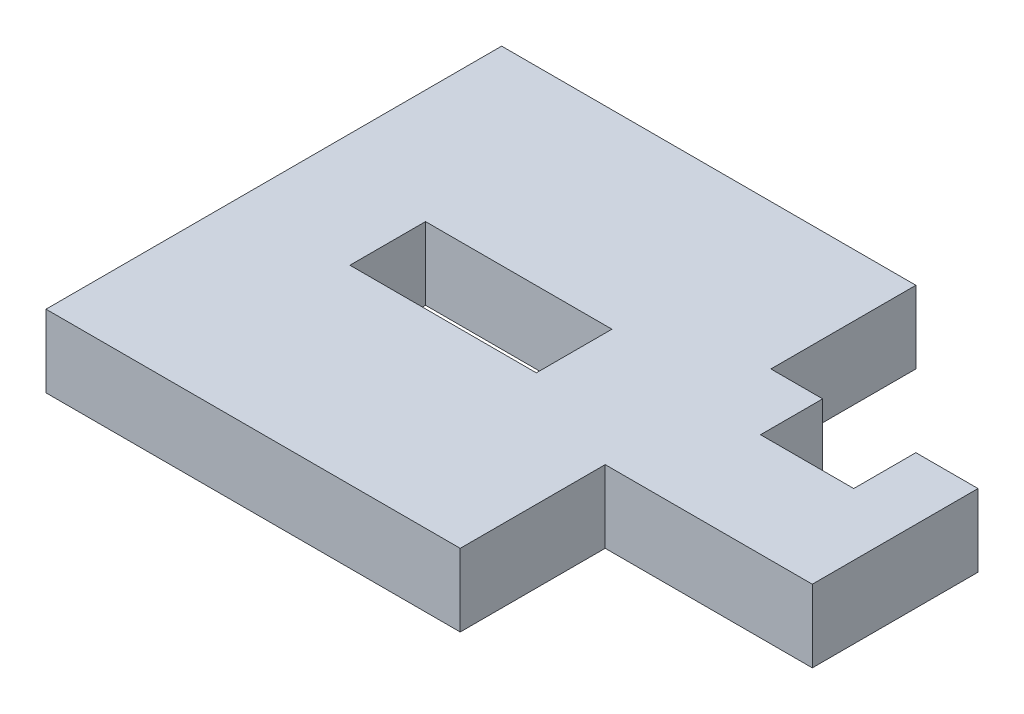
ISO-10303-21;
HEADER;
FILE_DESCRIPTION(('STEP AP214'),'2;1');
FILE_NAME('part.step','',(''),(''),'','','');
FILE_SCHEMA(('AUTOMOTIVE_DESIGN { 1 0 10303 214 1 1 1 1 }'));
ENDSEC;
DATA;
#1=APPLICATION_CONTEXT('core data for automotive mechanical design processes');
#2=APPLICATION_PROTOCOL_DEFINITION('international standard','automotive_design',2000,#1);
#3=PRODUCT_CONTEXT('',#1,'mechanical');
#4=PRODUCT('Part','Part','',(#3));
#5=PRODUCT_RELATED_PRODUCT_CATEGORY('part','',(#4));
#6=PRODUCT_DEFINITION_FORMATION('','',#4);
#7=PRODUCT_DEFINITION_CONTEXT('part definition',#1,'design');
#8=PRODUCT_DEFINITION('design','',#6,#7);
#9=PRODUCT_DEFINITION_SHAPE('','',#8);
#10=(LENGTH_UNIT() NAMED_UNIT(*) SI_UNIT(.MILLI.,.METRE.));
#11=(NAMED_UNIT(*) PLANE_ANGLE_UNIT() SI_UNIT($,.RADIAN.));
#12=(NAMED_UNIT(*) SI_UNIT($,.STERADIAN.) SOLID_ANGLE_UNIT());
#13=UNCERTAINTY_MEASURE_WITH_UNIT(LENGTH_MEASURE(1.E-05),#10,'distance_accuracy_value','');
#14=(GEOMETRIC_REPRESENTATION_CONTEXT(3) GLOBAL_UNCERTAINTY_ASSIGNED_CONTEXT((#13)) GLOBAL_UNIT_ASSIGNED_CONTEXT((#10,
#11,#12)) REPRESENTATION_CONTEXT('',''));
#15=CARTESIAN_POINT('',(0.,0.,0.));
#16=DIRECTION('',(0.,0.,1.));
#17=DIRECTION('',(1.,0.,0.));
#18=AXIS2_PLACEMENT_3D('',#15,#16,#17);
#19=CARTESIAN_POINT('',(0.,4.,0.));
#20=DIRECTION('',(0.,1.,0.));
#21=DIRECTION('',(0.,0.,1.));
#22=AXIS2_PLACEMENT_3D('',#19,#20,#21);
#23=PLANE('',#22);
#24=DIRECTION('',(-1.,0.,0.));
#25=VECTOR('',#24,1.);
#26=CARTESIAN_POINT('',(4.5,4.,-1.825));
#27=LINE('',#26,#25);
#28=CARTESIAN_POINT('',(4.5,4.,-1.825));
#29=VERTEX_POINT('',#28);
#30=CARTESIAN_POINT('',(-4.5,4.,-1.825));
#31=VERTEX_POINT('',#30);
#32=EDGE_CURVE('E253',#29,#31,#27,.T.);
#33=ORIENTED_EDGE('',*,*,#32,.F.);
#34=DIRECTION('',(0.,0.,-1.));
#35=VECTOR('',#34,1.);
#36=CARTESIAN_POINT('',(4.5,4.,1.825));
#37=LINE('',#36,#35);
#38=CARTESIAN_POINT('',(4.5,4.,1.825));
#39=VERTEX_POINT('',#38);
#40=EDGE_CURVE('E251',#39,#29,#37,.T.);
#41=ORIENTED_EDGE('',*,*,#40,.F.);
#42=DIRECTION('',(1.,0.,0.));
#43=VECTOR('',#42,1.);
#44=CARTESIAN_POINT('',(4.5,4.,1.825));
#45=LINE('',#44,#43);
#46=CARTESIAN_POINT('',(-4.5,4.,1.825));
#47=VERTEX_POINT('',#46);
#48=EDGE_CURVE('E258',#47,#39,#45,.T.);
#49=ORIENTED_EDGE('',*,*,#48,.F.);
#50=DIRECTION('',(0.,0.,1.));
#51=VECTOR('',#50,1.);
#52=CARTESIAN_POINT('',(-4.5,4.,1.825));
#53=LINE('',#52,#51);
#54=EDGE_CURVE('E255',#31,#47,#53,.T.);
#55=ORIENTED_EDGE('',*,*,#54,.F.);
#56=EDGE_LOOP('',(#33,#41,#49,#55));
#57=FACE_BOUND('',#56,.T.);
#58=DIRECTION('',(1.,0.,0.));
#59=VECTOR('',#58,1.);
#60=CARTESIAN_POINT('',(12.5,4.,-1.));
#61=LINE('',#60,#59);
#62=CARTESIAN_POINT('',(12.5,4.,-1.));
#63=VERTEX_POINT('',#62);
#64=CARTESIAN_POINT('',(17.,4.,-1.));
#65=VERTEX_POINT('',#64);
#66=EDGE_CURVE('E210',#63,#65,#61,.T.);
#67=ORIENTED_EDGE('',*,*,#66,.F.);
#68=DIRECTION('',(0.,0.,1.));
#69=VECTOR('',#68,1.);
#70=CARTESIAN_POINT('',(12.5,4.,-4.));
#71=LINE('',#70,#69);
#72=CARTESIAN_POINT('',(12.5,4.,-4.));
#73=VERTEX_POINT('',#72);
#74=EDGE_CURVE('E200',#73,#63,#71,.T.);
#75=ORIENTED_EDGE('',*,*,#74,.F.);
#76=DIRECTION('',(-1.,0.,0.));
#77=VECTOR('',#76,1.);
#78=CARTESIAN_POINT('',(10.,4.,-4.));
#79=LINE('',#78,#77);
#80=CARTESIAN_POINT('',(10.,4.,-4.));
#81=VERTEX_POINT('',#80);
#82=EDGE_CURVE('E236',#73,#81,#79,.T.);
#83=ORIENTED_EDGE('',*,*,#82,.T.);
#84=DIRECTION('',(0.,0.,-1.));
#85=VECTOR('',#84,1.);
#86=CARTESIAN_POINT('',(10.,4.,-11.));
#87=LINE('',#86,#85);
#88=CARTESIAN_POINT('',(10.,4.,-11.));
#89=VERTEX_POINT('',#88);
#90=EDGE_CURVE('E274',#81,#89,#87,.T.);
#91=ORIENTED_EDGE('',*,*,#90,.T.);
#92=DIRECTION('',(-1.,0.,0.));
#93=VECTOR('',#92,1.);
#94=CARTESIAN_POINT('',(-10.,4.,-11.));
#95=LINE('',#94,#93);
#96=CARTESIAN_POINT('',(-10.,4.,-11.));
#97=VERTEX_POINT('',#96);
#98=EDGE_CURVE('E278',#89,#97,#95,.T.);
#99=ORIENTED_EDGE('',*,*,#98,.T.);
#100=DIRECTION('',(0.,0.,1.));
#101=VECTOR('',#100,1.);
#102=CARTESIAN_POINT('',(-10.,4.,-11.));
#103=LINE('',#102,#101);
#104=CARTESIAN_POINT('',(-10.,4.,11.));
#105=VERTEX_POINT('',#104);
#106=EDGE_CURVE('E269',#97,#105,#103,.T.);
#107=ORIENTED_EDGE('',*,*,#106,.T.);
#108=DIRECTION('',(1.,0.,0.));
#109=VECTOR('',#108,1.);
#110=CARTESIAN_POINT('',(-10.,4.,11.));
#111=LINE('',#110,#109);
#112=CARTESIAN_POINT('',(10.,4.,11.));
#113=VERTEX_POINT('',#112);
#114=EDGE_CURVE('E272',#105,#113,#111,.T.);
#115=ORIENTED_EDGE('',*,*,#114,.T.);
#116=CARTESIAN_POINT('',(10.,4.,4.));
#117=VERTEX_POINT('',#116);
#118=EDGE_CURVE('E275',#113,#117,#87,.T.);
#119=ORIENTED_EDGE('',*,*,#118,.T.);
#120=DIRECTION('',(1.,0.,0.));
#121=VECTOR('',#120,1.);
#122=CARTESIAN_POINT('',(20.,4.,4.));
#123=LINE('',#122,#121);
#124=CARTESIAN_POINT('',(20.,4.,4.));
#125=VERTEX_POINT('',#124);
#126=EDGE_CURVE('E219',#117,#125,#123,.T.);
#127=ORIENTED_EDGE('',*,*,#126,.T.);
#128=DIRECTION('',(0.,0.,-1.));
#129=VECTOR('',#128,1.);
#130=CARTESIAN_POINT('',(20.,4.,-4.));
#131=LINE('',#130,#129);
#132=CARTESIAN_POINT('',(20.,4.,-4.));
#133=VERTEX_POINT('',#132);
#134=EDGE_CURVE('E234',#125,#133,#131,.T.);
#135=ORIENTED_EDGE('',*,*,#134,.T.);
#136=CARTESIAN_POINT('',(17.,4.,-4.));
#137=VERTEX_POINT('',#136);
#138=EDGE_CURVE('E237',#133,#137,#79,.T.);
#139=ORIENTED_EDGE('',*,*,#138,.T.);
#140=DIRECTION('',(0.,0.,-1.));
#141=VECTOR('',#140,1.);
#142=CARTESIAN_POINT('',(17.,4.,-4.));
#143=LINE('',#142,#141);
#144=EDGE_CURVE('E224',#65,#137,#143,.T.);
#145=ORIENTED_EDGE('',*,*,#144,.F.);
#146=EDGE_LOOP('',(#67,#75,#83,#91,#99,#107,#115,#119,#127,#135,#139,#145));
#147=FACE_BOUND('',#146,.T.);
#148=ADVANCED_FACE('F35',(#57,#147),#23,.T.);
#149=CARTESIAN_POINT('',(0.,0.,0.));
#150=DIRECTION('',(0.,1.,0.));
#151=DIRECTION('',(0.,0.,1.));
#152=AXIS2_PLACEMENT_3D('',#149,#150,#151);
#153=PLANE('',#152);
#154=DIRECTION('',(0.,0.,1.));
#155=VECTOR('',#154,1.);
#156=CARTESIAN_POINT('',(9.5,0.,0.));
#157=LINE('',#156,#155);
#158=CARTESIAN_POINT('',(9.5,0.,-10.5));
#159=VERTEX_POINT('',#158);
#160=CARTESIAN_POINT('',(9.5,0.,-3.5));
#161=VERTEX_POINT('',#160);
#162=EDGE_CURVE('E324',#159,#161,#157,.T.);
#163=ORIENTED_EDGE('',*,*,#162,.T.);
#164=DIRECTION('',(1.,0.,0.));
#165=VECTOR('',#164,1.);
#166=CARTESIAN_POINT('',(0.,0.,-3.5));
#167=LINE('',#166,#165);
#168=CARTESIAN_POINT('',(12.,0.,-3.5));
#169=VERTEX_POINT('',#168);
#170=EDGE_CURVE('E326',#161,#169,#167,.T.);
#171=ORIENTED_EDGE('',*,*,#170,.T.);
#172=DIRECTION('',(0.,0.,1.));
#173=VECTOR('',#172,1.);
#174=CARTESIAN_POINT('',(12.,0.,-1.));
#175=LINE('',#174,#173);
#176=CARTESIAN_POINT('',(12.,0.,-0.500000000000003));
#177=VERTEX_POINT('',#176);
#178=EDGE_CURVE('E304',#169,#177,#175,.T.);
#179=ORIENTED_EDGE('',*,*,#178,.T.);
#180=DIRECTION('',(1.,0.,0.));
#181=VECTOR('',#180,1.);
#182=CARTESIAN_POINT('',(17.,0.,-0.500000000000003));
#183=LINE('',#182,#181);
#184=CARTESIAN_POINT('',(17.5,0.,-0.500000000000003));
#185=VERTEX_POINT('',#184);
#186=EDGE_CURVE('E306',#177,#185,#183,.T.);
#187=ORIENTED_EDGE('',*,*,#186,.T.);
#188=DIRECTION('',(0.,0.,-1.));
#189=VECTOR('',#188,1.);
#190=CARTESIAN_POINT('',(17.5,0.,-4.));
#191=LINE('',#190,#189);
#192=CARTESIAN_POINT('',(17.5,0.,-3.5));
#193=VERTEX_POINT('',#192);
#194=EDGE_CURVE('E308',#185,#193,#191,.T.);
#195=ORIENTED_EDGE('',*,*,#194,.T.);
#196=DIRECTION('',(1.,0.,0.));
#197=VECTOR('',#196,1.);
#198=CARTESIAN_POINT('',(0.,0.,-3.5));
#199=LINE('',#198,#197);
#200=CARTESIAN_POINT('',(19.5,0.,-3.5));
#201=VERTEX_POINT('',#200);
#202=EDGE_CURVE('E310',#193,#201,#199,.T.);
#203=ORIENTED_EDGE('',*,*,#202,.T.);
#204=DIRECTION('',(0.,0.,1.));
#205=VECTOR('',#204,1.);
#206=CARTESIAN_POINT('',(19.5,0.,0.));
#207=LINE('',#206,#205);
#208=CARTESIAN_POINT('',(19.5,0.,3.5));
#209=VERTEX_POINT('',#208);
#210=EDGE_CURVE('E312',#201,#209,#207,.T.);
#211=ORIENTED_EDGE('',*,*,#210,.T.);
#212=DIRECTION('',(-1.,0.,0.));
#213=VECTOR('',#212,1.);
#214=CARTESIAN_POINT('',(0.,0.,3.5));
#215=LINE('',#214,#213);
#216=CARTESIAN_POINT('',(9.5,0.,3.5));
#217=VERTEX_POINT('',#216);
#218=EDGE_CURVE('E314',#209,#217,#215,.T.);
#219=ORIENTED_EDGE('',*,*,#218,.T.);
#220=DIRECTION('',(0.,0.,1.));
#221=VECTOR('',#220,1.);
#222=CARTESIAN_POINT('',(9.5,0.,0.));
#223=LINE('',#222,#221);
#224=CARTESIAN_POINT('',(9.5,0.,10.5));
#225=VERTEX_POINT('',#224);
#226=EDGE_CURVE('E316',#217,#225,#223,.T.);
#227=ORIENTED_EDGE('',*,*,#226,.T.);
#228=DIRECTION('',(-1.,0.,0.));
#229=VECTOR('',#228,1.);
#230=CARTESIAN_POINT('',(0.,0.,10.5));
#231=LINE('',#230,#229);
#232=CARTESIAN_POINT('',(-9.5,0.,10.5));
#233=VERTEX_POINT('',#232);
#234=EDGE_CURVE('E318',#225,#233,#231,.T.);
#235=ORIENTED_EDGE('',*,*,#234,.T.);
#236=DIRECTION('',(0.,0.,-1.));
#237=VECTOR('',#236,1.);
#238=CARTESIAN_POINT('',(-9.5,0.,0.));
#239=LINE('',#238,#237);
#240=CARTESIAN_POINT('',(-9.5,0.,-10.5));
#241=VERTEX_POINT('',#240);
#242=EDGE_CURVE('E320',#233,#241,#239,.T.);
#243=ORIENTED_EDGE('',*,*,#242,.T.);
#244=DIRECTION('',(1.,0.,0.));
#245=VECTOR('',#244,1.);
#246=CARTESIAN_POINT('',(0.,0.,-10.5));
#247=LINE('',#246,#245);
#248=EDGE_CURVE('E322',#241,#159,#247,.T.);
#249=ORIENTED_EDGE('',*,*,#248,.T.);
#250=EDGE_LOOP('',(#163,#171,#179,#187,#195,#203,#211,#219,#227,#235,#243,#249));
#251=FACE_BOUND('',#250,.T.);
#252=DIRECTION('',(0.,0.,1.));
#253=VECTOR('',#252,1.);
#254=CARTESIAN_POINT('',(-5.,0.,1.825));
#255=LINE('',#254,#253);
#256=CARTESIAN_POINT('',(-5.,0.,-2.325));
#257=VERTEX_POINT('',#256);
#258=CARTESIAN_POINT('',(-5.,0.,2.325));
#259=VERTEX_POINT('',#258);
#260=EDGE_CURVE('E299',#257,#259,#255,.T.);
#261=ORIENTED_EDGE('',*,*,#260,.T.);
#262=DIRECTION('',(1.,0.,0.));
#263=VECTOR('',#262,1.);
#264=CARTESIAN_POINT('',(4.5,0.,2.325));
#265=LINE('',#264,#263);
#266=CARTESIAN_POINT('',(5.,0.,2.325));
#267=VERTEX_POINT('',#266);
#268=EDGE_CURVE('E301',#259,#267,#265,.T.);
#269=ORIENTED_EDGE('',*,*,#268,.T.);
#270=DIRECTION('',(0.,0.,-1.));
#271=VECTOR('',#270,1.);
#272=CARTESIAN_POINT('',(5.,0.,-1.825));
#273=LINE('',#272,#271);
#274=CARTESIAN_POINT('',(5.,0.,-2.325));
#275=VERTEX_POINT('',#274);
#276=EDGE_CURVE('E295',#267,#275,#273,.T.);
#277=ORIENTED_EDGE('',*,*,#276,.T.);
#278=DIRECTION('',(-1.,0.,0.));
#279=VECTOR('',#278,1.);
#280=CARTESIAN_POINT('',(-4.5,0.,-2.325));
#281=LINE('',#280,#279);
#282=EDGE_CURVE('E297',#275,#257,#281,.T.);
#283=ORIENTED_EDGE('',*,*,#282,.T.);
#284=EDGE_LOOP('',(#261,#269,#277,#283));
#285=FACE_BOUND('',#284,.T.);
#286=ADVANCED_FACE('F419',(#251,#285),#153,.F.);
#287=CARTESIAN_POINT('',(10.,4.,-4.));
#288=DIRECTION('',(0.,0.,1.));
#289=DIRECTION('',(1.,0.,0.));
#290=AXIS2_PLACEMENT_3D('',#287,#288,#289);
#291=PLANE('',#290);
#292=DIRECTION('',(0.,-1.,0.));
#293=VECTOR('',#292,1.);
#294=CARTESIAN_POINT('',(12.5,4.,-4.));
#295=LINE('',#294,#293);
#296=CARTESIAN_POINT('',(12.5,0.5,-4.));
#297=VERTEX_POINT('',#296);
#298=EDGE_CURVE('E206',#73,#297,#295,.T.);
#299=ORIENTED_EDGE('',*,*,#298,.T.);
#300=DIRECTION('',(-1.,0.,0.));
#301=VECTOR('',#300,1.);
#302=CARTESIAN_POINT('',(10.,0.5,-4.));
#303=LINE('',#302,#301);
#304=CARTESIAN_POINT('',(10.,0.5,-4.));
#305=VERTEX_POINT('',#304);
#306=EDGE_CURVE('E292',#297,#305,#303,.T.);
#307=ORIENTED_EDGE('',*,*,#306,.T.);
#308=DIRECTION('',(0.,-1.,0.));
#309=VECTOR('',#308,1.);
#310=CARTESIAN_POINT('',(10.,4.,-4.));
#311=LINE('',#310,#309);
#312=EDGE_CURVE('E239',#81,#305,#311,.T.);
#313=ORIENTED_EDGE('',*,*,#312,.F.);
#314=ORIENTED_EDGE('',*,*,#82,.F.);
#315=EDGE_LOOP('',(#299,#307,#313,#314));
#316=FACE_BOUND('',#315,.T.);
#317=ADVANCED_FACE('F421',(#316),#291,.F.);
#318=DIRECTION('',(0.,-1.,0.));
#319=VECTOR('',#318,1.);
#320=CARTESIAN_POINT('',(20.,4.,-4.));
#321=LINE('',#320,#319);
#322=CARTESIAN_POINT('',(20.,0.5,-4.));
#323=VERTEX_POINT('',#322);
#324=EDGE_CURVE('E242',#133,#323,#321,.T.);
#325=ORIENTED_EDGE('',*,*,#324,.T.);
#326=DIRECTION('',(-1.,0.,0.));
#327=VECTOR('',#326,1.);
#328=CARTESIAN_POINT('',(10.,0.5,-4.));
#329=LINE('',#328,#327);
#330=CARTESIAN_POINT('',(17.,0.5,-4.));
#331=VERTEX_POINT('',#330);
#332=EDGE_CURVE('E343',#323,#331,#329,.T.);
#333=ORIENTED_EDGE('',*,*,#332,.T.);
#334=DIRECTION('',(0.,-1.,0.));
#335=VECTOR('',#334,1.);
#336=CARTESIAN_POINT('',(17.,4.,-4.));
#337=LINE('',#336,#335);
#338=EDGE_CURVE('E229',#137,#331,#337,.T.);
#339=ORIENTED_EDGE('',*,*,#338,.F.);
#340=ORIENTED_EDGE('',*,*,#138,.F.);
#341=EDGE_LOOP('',(#325,#333,#339,#340));
#342=FACE_BOUND('',#341,.T.);
#343=ADVANCED_FACE('F428',(#342),#291,.F.);
#344=CARTESIAN_POINT('',(10.,4.,-11.));
#345=DIRECTION('',(-1.,0.,0.));
#346=DIRECTION('',(0.,0.,1.));
#347=AXIS2_PLACEMENT_3D('',#344,#345,#346);
#348=PLANE('',#347);
#349=DIRECTION('',(0.,-1.,0.));
#350=VECTOR('',#349,1.);
#351=CARTESIAN_POINT('',(10.,4.,11.));
#352=LINE('',#351,#350);
#353=CARTESIAN_POINT('',(10.,0.5,11.));
#354=VERTEX_POINT('',#353);
#355=EDGE_CURVE('E286',#113,#354,#352,.T.);
#356=ORIENTED_EDGE('',*,*,#355,.T.);
#357=DIRECTION('',(0.,0.,-1.));
#358=VECTOR('',#357,1.);
#359=CARTESIAN_POINT('',(10.,0.5,-11.));
#360=LINE('',#359,#358);
#361=CARTESIAN_POINT('',(10.,0.5,4.));
#362=VERTEX_POINT('',#361);
#363=EDGE_CURVE('E337',#354,#362,#360,.T.);
#364=ORIENTED_EDGE('',*,*,#363,.T.);
#365=DIRECTION('',(0.,-1.,0.));
#366=VECTOR('',#365,1.);
#367=CARTESIAN_POINT('',(10.,4.,4.));
#368=LINE('',#367,#366);
#369=EDGE_CURVE('E248',#117,#362,#368,.T.);
#370=ORIENTED_EDGE('',*,*,#369,.F.);
#371=ORIENTED_EDGE('',*,*,#118,.F.);
#372=EDGE_LOOP('',(#356,#364,#370,#371));
#373=FACE_BOUND('',#372,.T.);
#374=ADVANCED_FACE('F444',(#373),#348,.F.);
#375=CARTESIAN_POINT('',(-10.,4.,-11.));
#376=DIRECTION('',(1.,0.,0.));
#377=DIRECTION('',(0.,0.,-1.));
#378=AXIS2_PLACEMENT_3D('',#375,#376,#377);
#379=PLANE('',#378);
#380=DIRECTION('',(0.,-1.,0.));
#381=VECTOR('',#380,1.);
#382=CARTESIAN_POINT('',(-10.,4.,-11.));
#383=LINE('',#382,#381);
#384=CARTESIAN_POINT('',(-10.,0.5,-11.));
#385=VERTEX_POINT('',#384);
#386=EDGE_CURVE('E280',#97,#385,#383,.T.);
#387=ORIENTED_EDGE('',*,*,#386,.T.);
#388=DIRECTION('',(0.,0.,1.));
#389=VECTOR('',#388,1.);
#390=CARTESIAN_POINT('',(-10.,0.5,-11.));
#391=LINE('',#390,#389);
#392=CARTESIAN_POINT('',(-10.,0.5,11.));
#393=VERTEX_POINT('',#392);
#394=EDGE_CURVE('E333',#385,#393,#391,.T.);
#395=ORIENTED_EDGE('',*,*,#394,.T.);
#396=DIRECTION('',(0.,-1.,0.));
#397=VECTOR('',#396,1.);
#398=CARTESIAN_POINT('',(-10.,4.,11.));
#399=LINE('',#398,#397);
#400=EDGE_CURVE('E289',#105,#393,#399,.T.);
#401=ORIENTED_EDGE('',*,*,#400,.F.);
#402=ORIENTED_EDGE('',*,*,#106,.F.);
#403=EDGE_LOOP('',(#387,#395,#401,#402));
#404=FACE_BOUND('',#403,.T.);
#405=ADVANCED_FACE('F447',(#404),#379,.F.);
#406=CARTESIAN_POINT('',(-10.,4.,11.));
#407=DIRECTION('',(0.,0.,-1.));
#408=DIRECTION('',(-1.,0.,0.));
#409=AXIS2_PLACEMENT_3D('',#406,#407,#408);
#410=PLANE('',#409);
#411=ORIENTED_EDGE('',*,*,#400,.T.);
#412=DIRECTION('',(1.,0.,0.));
#413=VECTOR('',#412,1.);
#414=CARTESIAN_POINT('',(-10.,0.5,11.));
#415=LINE('',#414,#413);
#416=EDGE_CURVE('E335',#393,#354,#415,.T.);
#417=ORIENTED_EDGE('',*,*,#416,.T.);
#418=ORIENTED_EDGE('',*,*,#355,.F.);
#419=ORIENTED_EDGE('',*,*,#114,.F.);
#420=EDGE_LOOP('',(#411,#417,#418,#419));
#421=FACE_BOUND('',#420,.T.);
#422=ADVANCED_FACE('F442',(#421),#410,.F.);
#423=ORIENTED_EDGE('',*,*,#312,.T.);
#424=DIRECTION('',(0.,0.,-1.));
#425=VECTOR('',#424,1.);
#426=CARTESIAN_POINT('',(10.,0.5,-11.));
#427=LINE('',#426,#425);
#428=CARTESIAN_POINT('',(10.,0.5,-11.));
#429=VERTEX_POINT('',#428);
#430=EDGE_CURVE('E329',#305,#429,#427,.T.);
#431=ORIENTED_EDGE('',*,*,#430,.T.);
#432=DIRECTION('',(0.,-1.,0.));
#433=VECTOR('',#432,1.);
#434=CARTESIAN_POINT('',(10.,4.,-11.));
#435=LINE('',#434,#433);
#436=EDGE_CURVE('E283',#89,#429,#435,.T.);
#437=ORIENTED_EDGE('',*,*,#436,.F.);
#438=ORIENTED_EDGE('',*,*,#90,.F.);
#439=EDGE_LOOP('',(#423,#431,#437,#438));
#440=FACE_BOUND('',#439,.T.);
#441=ADVANCED_FACE('F438',(#440),#348,.F.);
#442=CARTESIAN_POINT('',(-10.,4.,-11.));
#443=DIRECTION('',(0.,0.,1.));
#444=DIRECTION('',(1.,0.,0.));
#445=AXIS2_PLACEMENT_3D('',#442,#443,#444);
#446=PLANE('',#445);
#447=ORIENTED_EDGE('',*,*,#436,.T.);
#448=DIRECTION('',(-1.,0.,0.));
#449=VECTOR('',#448,1.);
#450=CARTESIAN_POINT('',(-10.,0.5,-11.));
#451=LINE('',#450,#449);
#452=EDGE_CURVE('E331',#429,#385,#451,.T.);
#453=ORIENTED_EDGE('',*,*,#452,.T.);
#454=ORIENTED_EDGE('',*,*,#386,.F.);
#455=ORIENTED_EDGE('',*,*,#98,.F.);
#456=EDGE_LOOP('',(#447,#453,#454,#455));
#457=FACE_BOUND('',#456,.T.);
#458=ADVANCED_FACE('F435',(#457),#446,.F.);
#459=CARTESIAN_POINT('',(4.5,4.,1.825));
#460=DIRECTION('',(-1.,0.,0.));
#461=DIRECTION('',(0.,0.,1.));
#462=AXIS2_PLACEMENT_3D('',#459,#460,#461);
#463=PLANE('',#462);
#464=DIRECTION('',(0.,-1.,0.));
#465=VECTOR('',#464,1.);
#466=CARTESIAN_POINT('',(4.5,4.,-1.825));
#467=LINE('',#466,#465);
#468=CARTESIAN_POINT('',(4.5,0.5,-1.825));
#469=VERTEX_POINT('',#468);
#470=EDGE_CURVE('E267',#29,#469,#467,.T.);
#471=ORIENTED_EDGE('',*,*,#470,.T.);
#472=DIRECTION('',(0.,0.,1.));
#473=VECTOR('',#472,1.);
#474=CARTESIAN_POINT('',(4.5,0.5,1.825));
#475=LINE('',#474,#473);
#476=CARTESIAN_POINT('',(4.5,0.5,1.825));
#477=VERTEX_POINT('',#476);
#478=EDGE_CURVE('E11',#469,#477,#475,.T.);
#479=ORIENTED_EDGE('',*,*,#478,.T.);
#480=DIRECTION('',(0.,-1.,0.));
#481=VECTOR('',#480,1.);
#482=CARTESIAN_POINT('',(4.5,4.,1.825));
#483=LINE('',#482,#481);
#484=EDGE_CURVE('E260',#39,#477,#483,.T.);
#485=ORIENTED_EDGE('',*,*,#484,.F.);
#486=ORIENTED_EDGE('',*,*,#40,.T.);
#487=EDGE_LOOP('',(#471,#479,#485,#486));
#488=FACE_BOUND('',#487,.T.);
#489=ADVANCED_FACE('F409',(#488),#463,.T.);
#490=CARTESIAN_POINT('',(4.5,4.,-1.825));
#491=DIRECTION('',(0.,0.,1.));
#492=DIRECTION('',(1.,0.,0.));
#493=AXIS2_PLACEMENT_3D('',#490,#491,#492);
#494=PLANE('',#493);
#495=DIRECTION('',(0.,-1.,0.));
#496=VECTOR('',#495,1.);
#497=CARTESIAN_POINT('',(-4.5,4.,-1.825));
#498=LINE('',#497,#496);
#499=CARTESIAN_POINT('',(-4.5,0.5,-1.825));
#500=VERTEX_POINT('',#499);
#501=EDGE_CURVE('E265',#31,#500,#498,.T.);
#502=ORIENTED_EDGE('',*,*,#501,.T.);
#503=DIRECTION('',(1.,0.,0.));
#504=VECTOR('',#503,1.);
#505=CARTESIAN_POINT('',(4.5,0.5,-1.825));
#506=LINE('',#505,#504);
#507=EDGE_CURVE('E45',#500,#469,#506,.T.);
#508=ORIENTED_EDGE('',*,*,#507,.T.);
#509=ORIENTED_EDGE('',*,*,#470,.F.);
#510=ORIENTED_EDGE('',*,*,#32,.T.);
#511=EDGE_LOOP('',(#502,#508,#509,#510));
#512=FACE_BOUND('',#511,.T.);
#513=ADVANCED_FACE('F651',(#512),#494,.T.);
#514=CARTESIAN_POINT('',(-4.5,4.,1.825));
#515=DIRECTION('',(1.,0.,0.));
#516=DIRECTION('',(0.,0.,-1.));
#517=AXIS2_PLACEMENT_3D('',#514,#515,#516);
#518=PLANE('',#517);
#519=DIRECTION('',(0.,-1.,0.));
#520=VECTOR('',#519,1.);
#521=CARTESIAN_POINT('',(-4.5,4.,1.825));
#522=LINE('',#521,#520);
#523=CARTESIAN_POINT('',(-4.5,0.5,1.825));
#524=VERTEX_POINT('',#523);
#525=EDGE_CURVE('E263',#47,#524,#522,.T.);
#526=ORIENTED_EDGE('',*,*,#525,.T.);
#527=DIRECTION('',(0.,0.,-1.));
#528=VECTOR('',#527,1.);
#529=CARTESIAN_POINT('',(-4.5,0.5,-1.825));
#530=LINE('',#529,#528);
#531=EDGE_CURVE('E60',#524,#500,#530,.T.);
#532=ORIENTED_EDGE('',*,*,#531,.T.);
#533=ORIENTED_EDGE('',*,*,#501,.F.);
#534=ORIENTED_EDGE('',*,*,#54,.T.);
#535=EDGE_LOOP('',(#526,#532,#533,#534));
#536=FACE_BOUND('',#535,.T.);
#537=ADVANCED_FACE('F644',(#536),#518,.T.);
#538=CARTESIAN_POINT('',(4.5,4.,1.825));
#539=DIRECTION('',(0.,0.,-1.));
#540=DIRECTION('',(-1.,0.,0.));
#541=AXIS2_PLACEMENT_3D('',#538,#539,#540);
#542=PLANE('',#541);
#543=ORIENTED_EDGE('',*,*,#484,.T.);
#544=DIRECTION('',(-1.,0.,0.));
#545=VECTOR('',#544,1.);
#546=CARTESIAN_POINT('',(-4.5,0.5,1.825));
#547=LINE('',#546,#545);
#548=EDGE_CURVE('E350',#477,#524,#547,.T.);
#549=ORIENTED_EDGE('',*,*,#548,.T.);
#550=ORIENTED_EDGE('',*,*,#525,.F.);
#551=ORIENTED_EDGE('',*,*,#48,.T.);
#552=EDGE_LOOP('',(#543,#549,#550,#551));
#553=FACE_BOUND('',#552,.T.);
#554=ADVANCED_FACE('F413',(#553),#542,.T.);
#555=CARTESIAN_POINT('',(20.,4.,4.));
#556=DIRECTION('',(0.,0.,-1.));
#557=DIRECTION('',(-1.,0.,0.));
#558=AXIS2_PLACEMENT_3D('',#555,#556,#557);
#559=PLANE('',#558);
#560=ORIENTED_EDGE('',*,*,#369,.T.);
#561=DIRECTION('',(1.,0.,0.));
#562=VECTOR('',#561,1.);
#563=CARTESIAN_POINT('',(20.,0.5,4.));
#564=LINE('',#563,#562);
#565=CARTESIAN_POINT('',(20.,0.5,4.));
#566=VERTEX_POINT('',#565);
#567=EDGE_CURVE('E339',#362,#566,#564,.T.);
#568=ORIENTED_EDGE('',*,*,#567,.T.);
#569=DIRECTION('',(0.,-1.,0.));
#570=VECTOR('',#569,1.);
#571=CARTESIAN_POINT('',(20.,4.,4.));
#572=LINE('',#571,#570);
#573=EDGE_CURVE('E245',#125,#566,#572,.T.);
#574=ORIENTED_EDGE('',*,*,#573,.F.);
#575=ORIENTED_EDGE('',*,*,#126,.F.);
#576=EDGE_LOOP('',(#560,#568,#574,#575));
#577=FACE_BOUND('',#576,.T.);
#578=ADVANCED_FACE('F629',(#577),#559,.F.);
#579=CARTESIAN_POINT('',(20.,4.,-4.));
#580=DIRECTION('',(-1.,0.,0.));
#581=DIRECTION('',(0.,0.,1.));
#582=AXIS2_PLACEMENT_3D('',#579,#580,#581);
#583=PLANE('',#582);
#584=ORIENTED_EDGE('',*,*,#573,.T.);
#585=DIRECTION('',(0.,0.,-1.));
#586=VECTOR('',#585,1.);
#587=CARTESIAN_POINT('',(20.,0.5,-4.));
#588=LINE('',#587,#586);
#589=EDGE_CURVE('E341',#566,#323,#588,.T.);
#590=ORIENTED_EDGE('',*,*,#589,.T.);
#591=ORIENTED_EDGE('',*,*,#324,.F.);
#592=ORIENTED_EDGE('',*,*,#134,.F.);
#593=EDGE_LOOP('',(#584,#590,#591,#592));
#594=FACE_BOUND('',#593,.T.);
#595=ADVANCED_FACE('F622',(#594),#583,.F.);
#596=CARTESIAN_POINT('',(12.5,4.,-4.));
#597=DIRECTION('',(1.,0.,0.));
#598=DIRECTION('',(0.,0.,-1.));
#599=AXIS2_PLACEMENT_3D('',#596,#597,#598);
#600=PLANE('',#599);
#601=DIRECTION('',(0.,-1.,0.));
#602=VECTOR('',#601,1.);
#603=CARTESIAN_POINT('',(12.5,4.,-1.));
#604=LINE('',#603,#602);
#605=CARTESIAN_POINT('',(12.5,0.5,-1.));
#606=VERTEX_POINT('',#605);
#607=EDGE_CURVE('E203',#63,#606,#604,.T.);
#608=ORIENTED_EDGE('',*,*,#607,.T.);
#609=DIRECTION('',(0.,0.,-1.));
#610=VECTOR('',#609,1.);
#611=CARTESIAN_POINT('',(12.5,0.5,-4.));
#612=LINE('',#611,#610);
#613=EDGE_CURVE('E348',#606,#297,#612,.T.);
#614=ORIENTED_EDGE('',*,*,#613,.T.);
#615=ORIENTED_EDGE('',*,*,#298,.F.);
#616=ORIENTED_EDGE('',*,*,#74,.T.);
#617=EDGE_LOOP('',(#608,#614,#615,#616));
#618=FACE_BOUND('',#617,.T.);
#619=ADVANCED_FACE('F202',(#618),#600,.T.);
#620=CARTESIAN_POINT('',(12.5,4.,-1.));
#621=DIRECTION('',(0.,0.,-1.));
#622=DIRECTION('',(-1.,0.,0.));
#623=AXIS2_PLACEMENT_3D('',#620,#621,#622);
#624=PLANE('',#623);
#625=DIRECTION('',(0.,-1.,0.));
#626=VECTOR('',#625,1.);
#627=CARTESIAN_POINT('',(17.,4.,-1.));
#628=LINE('',#627,#626);
#629=CARTESIAN_POINT('',(17.,0.5,-1.));
#630=VERTEX_POINT('',#629);
#631=EDGE_CURVE('E220',#65,#630,#628,.T.);
#632=ORIENTED_EDGE('',*,*,#631,.T.);
#633=DIRECTION('',(-1.,0.,0.));
#634=VECTOR('',#633,1.);
#635=CARTESIAN_POINT('',(12.5,0.5,-1.));
#636=LINE('',#635,#634);
#637=EDGE_CURVE('E218',#630,#606,#636,.T.);
#638=ORIENTED_EDGE('',*,*,#637,.T.);
#639=ORIENTED_EDGE('',*,*,#607,.F.);
#640=ORIENTED_EDGE('',*,*,#66,.T.);
#641=EDGE_LOOP('',(#632,#638,#639,#640));
#642=FACE_BOUND('',#641,.T.);
#643=ADVANCED_FACE('F215',(#642),#624,.T.);
#644=CARTESIAN_POINT('',(17.,4.,-4.));
#645=DIRECTION('',(-1.,0.,0.));
#646=DIRECTION('',(0.,0.,1.));
#647=AXIS2_PLACEMENT_3D('',#644,#645,#646);
#648=PLANE('',#647);
#649=ORIENTED_EDGE('',*,*,#338,.T.);
#650=DIRECTION('',(0.,0.,1.));
#651=VECTOR('',#650,1.);
#652=CARTESIAN_POINT('',(17.,0.5,-1.));
#653=LINE('',#652,#651);
#654=EDGE_CURVE('E345',#331,#630,#653,.T.);
#655=ORIENTED_EDGE('',*,*,#654,.T.);
#656=ORIENTED_EDGE('',*,*,#631,.F.);
#657=ORIENTED_EDGE('',*,*,#144,.T.);
#658=EDGE_LOOP('',(#649,#655,#656,#657));
#659=FACE_BOUND('',#658,.T.);
#660=ADVANCED_FACE('F535',(#659),#648,.T.);
#661=CARTESIAN_POINT('',(20.,0.5,4.));
#662=DIRECTION('',(0.,0.707106781186545,-0.70710678118655));
#663=DIRECTION('',(1.,0.,0.));
#664=AXIS2_PLACEMENT_3D('',#661,#662,#663);
#665=PLANE('',#664);
#666=DIRECTION('',(-0.577350269189624,-0.577350269189628,-0.577350269189624));
#667=VECTOR('',#666,1.);
#668=CARTESIAN_POINT('',(5.00000000000002,-4.50000000000001,-0.999999999999977));
#669=LINE('',#668,#667);
#670=EDGE_CURVE('E383',#217,#362,#669,.F.);
#671=ORIENTED_EDGE('',*,*,#670,.F.);
#672=ORIENTED_EDGE('',*,*,#218,.F.);
#673=DIRECTION('',(-0.577350269189624,-0.577350269189628,-0.577350269189624));
#674=VECTOR('',#673,1.);
#675=CARTESIAN_POINT('',(17.3333333333333,-2.16666666666667,1.33333333333335));
#676=LINE('',#675,#674);
#677=EDGE_CURVE('E211',#566,#209,#676,.T.);
#678=ORIENTED_EDGE('',*,*,#677,.F.);
#679=ORIENTED_EDGE('',*,*,#567,.F.);
#680=EDGE_LOOP('',(#671,#672,#678,#679));
#681=FACE_BOUND('',#680,.T.);
#682=ADVANCED_FACE('F529',(#681),#665,.F.);
#683=CARTESIAN_POINT('',(20.,0.5,-4.));
#684=DIRECTION('',(-0.70710678118655,0.707106781186545,0.));
#685=DIRECTION('',(0.,0.,-1.));
#686=AXIS2_PLACEMENT_3D('',#683,#684,#685);
#687=PLANE('',#686);
#688=ORIENTED_EDGE('',*,*,#677,.T.);
#689=ORIENTED_EDGE('',*,*,#210,.F.);
#690=DIRECTION('',(-0.577350269189624,-0.577350269189628,0.577350269189624));
#691=VECTOR('',#690,1.);
#692=CARTESIAN_POINT('',(16.6666666666667,-2.83333333333334,-0.666666666666681));
#693=LINE('',#692,#691);
#694=EDGE_CURVE('E380',#323,#201,#693,.T.);
#695=ORIENTED_EDGE('',*,*,#694,.F.);
#696=ORIENTED_EDGE('',*,*,#589,.F.);
#697=EDGE_LOOP('',(#688,#689,#695,#696));
#698=FACE_BOUND('',#697,.T.);
#699=ADVANCED_FACE('F522',(#698),#687,.F.);
#700=CARTESIAN_POINT('',(10.,0.5,-11.));
#701=DIRECTION('',(-0.70710678118655,0.707106781186545,0.));
#702=DIRECTION('',(0.,0.,-1.));
#703=AXIS2_PLACEMENT_3D('',#700,#701,#702);
#704=PLANE('',#703);
#705=ORIENTED_EDGE('',*,*,#670,.T.);
#706=ORIENTED_EDGE('',*,*,#363,.F.);
#707=DIRECTION('',(-0.577350269189624,-0.577350269189628,-0.577350269189624));
#708=VECTOR('',#707,1.);
#709=CARTESIAN_POINT('',(2.6666666666667,-6.83333333333335,3.6666666666667));
#710=LINE('',#709,#708);
#711=EDGE_CURVE('E377',#225,#354,#710,.F.);
#712=ORIENTED_EDGE('',*,*,#711,.F.);
#713=ORIENTED_EDGE('',*,*,#226,.F.);
#714=EDGE_LOOP('',(#705,#706,#712,#713));
#715=FACE_BOUND('',#714,.T.);
#716=ADVANCED_FACE('F515',(#715),#704,.F.);
#717=CARTESIAN_POINT('',(10.,0.5,-4.));
#718=DIRECTION('',(0.,0.707106781186545,0.70710678118655));
#719=DIRECTION('',(-1.,0.,0.));
#720=AXIS2_PLACEMENT_3D('',#717,#718,#719);
#721=PLANE('',#720);
#722=ORIENTED_EDGE('',*,*,#694,.T.);
#723=ORIENTED_EDGE('',*,*,#202,.F.);
#724=DIRECTION('',(-0.577350269189624,0.577350269189628,-0.577350269189624));
#725=VECTOR('',#724,1.);
#726=CARTESIAN_POINT('',(18.6666666666667,-1.16666666666667,-2.33333333333334));
#727=LINE('',#726,#725);
#728=EDGE_CURVE('E374',#331,#193,#727,.F.);
#729=ORIENTED_EDGE('',*,*,#728,.F.);
#730=ORIENTED_EDGE('',*,*,#332,.F.);
#731=EDGE_LOOP('',(#722,#723,#729,#730));
#732=FACE_BOUND('',#731,.T.);
#733=ADVANCED_FACE('F508',(#732),#721,.F.);
#734=CARTESIAN_POINT('',(-10.,0.5,11.));
#735=DIRECTION('',(0.,0.707106781186545,-0.70710678118655));
#736=DIRECTION('',(1.,0.,0.));
#737=AXIS2_PLACEMENT_3D('',#734,#735,#736);
#738=PLANE('',#737);
#739=ORIENTED_EDGE('',*,*,#711,.T.);
#740=ORIENTED_EDGE('',*,*,#416,.F.);
#741=DIRECTION('',(0.577350269189624,-0.577350269189628,-0.577350269189624));
#742=VECTOR('',#741,1.);
#743=CARTESIAN_POINT('',(-10.,0.5,11.));
#744=LINE('',#743,#742);
#745=EDGE_CURVE('E371',#233,#393,#744,.F.);
#746=ORIENTED_EDGE('',*,*,#745,.F.);
#747=ORIENTED_EDGE('',*,*,#234,.F.);
#748=EDGE_LOOP('',(#739,#740,#746,#747));
#749=FACE_BOUND('',#748,.T.);
#750=ADVANCED_FACE('F501',(#749),#738,.F.);
#751=CARTESIAN_POINT('',(17.5,0.,0.));
#752=DIRECTION('',(-0.70710678118655,-0.707106781186545,0.));
#753=DIRECTION('',(0.,0.,1.));
#754=AXIS2_PLACEMENT_3D('',#751,#752,#753);
#755=PLANE('',#754);
#756=ORIENTED_EDGE('',*,*,#728,.T.);
#757=ORIENTED_EDGE('',*,*,#194,.F.);
#758=DIRECTION('',(0.577350269189624,-0.577350269189628,0.577350269189624));
#759=VECTOR('',#758,1.);
#760=CARTESIAN_POINT('',(17.6666666666667,-0.166666666666668,-0.333333333333336));
#761=LINE('',#760,#759);
#762=EDGE_CURVE('E368',#630,#185,#761,.T.);
#763=ORIENTED_EDGE('',*,*,#762,.F.);
#764=ORIENTED_EDGE('',*,*,#654,.F.);
#765=EDGE_LOOP('',(#756,#757,#763,#764));
#766=FACE_BOUND('',#765,.T.);
#767=ADVANCED_FACE('F494',(#766),#755,.T.);
#768=CARTESIAN_POINT('',(-10.,0.5,-11.));
#769=DIRECTION('',(0.70710678118655,0.707106781186545,0.));
#770=DIRECTION('',(0.,0.,1.));
#771=AXIS2_PLACEMENT_3D('',#768,#769,#770);
#772=PLANE('',#771);
#773=ORIENTED_EDGE('',*,*,#745,.T.);
#774=ORIENTED_EDGE('',*,*,#394,.F.);
#775=DIRECTION('',(0.577350269189624,-0.577350269189628,0.577350269189624));
#776=VECTOR('',#775,1.);
#777=CARTESIAN_POINT('',(-10.,0.5,-11.));
#778=LINE('',#777,#776);
#779=EDGE_CURVE('E365',#241,#385,#778,.F.);
#780=ORIENTED_EDGE('',*,*,#779,.F.);
#781=ORIENTED_EDGE('',*,*,#242,.F.);
#782=EDGE_LOOP('',(#773,#774,#780,#781));
#783=FACE_BOUND('',#782,.T.);
#784=ADVANCED_FACE('F487',(#783),#772,.F.);
#785=CARTESIAN_POINT('',(0.,0.,-0.500000000000003));
#786=DIRECTION('',(0.,-0.707106781186545,-0.70710678118655));
#787=DIRECTION('',(-1.,0.,0.));
#788=AXIS2_PLACEMENT_3D('',#785,#786,#787);
#789=PLANE('',#788);
#790=ORIENTED_EDGE('',*,*,#762,.T.);
#791=ORIENTED_EDGE('',*,*,#186,.F.);
#792=DIRECTION('',(-0.577350269189624,-0.577350269189628,0.577350269189624));
#793=VECTOR('',#792,1.);
#794=CARTESIAN_POINT('',(8.00000000000002,-4.00000000000001,3.49999999999998));
#795=LINE('',#794,#793);
#796=EDGE_CURVE('E362',#606,#177,#795,.T.);
#797=ORIENTED_EDGE('',*,*,#796,.F.);
#798=ORIENTED_EDGE('',*,*,#637,.F.);
#799=EDGE_LOOP('',(#790,#791,#797,#798));
#800=FACE_BOUND('',#799,.T.);
#801=ADVANCED_FACE('F480',(#800),#789,.T.);
#802=CARTESIAN_POINT('',(-10.,0.5,-11.));
#803=DIRECTION('',(0.,0.707106781186545,0.70710678118655));
#804=DIRECTION('',(-1.,0.,0.));
#805=AXIS2_PLACEMENT_3D('',#802,#803,#804);
#806=PLANE('',#805);
#807=ORIENTED_EDGE('',*,*,#779,.T.);
#808=ORIENTED_EDGE('',*,*,#452,.F.);
#809=DIRECTION('',(-0.577350269189624,-0.577350269189628,0.577350269189624));
#810=VECTOR('',#809,1.);
#811=CARTESIAN_POINT('',(3.33333333333337,-6.16666666666668,-4.33333333333336));
#812=LINE('',#811,#810);
#813=EDGE_CURVE('E359',#159,#429,#812,.F.);
#814=ORIENTED_EDGE('',*,*,#813,.F.);
#815=ORIENTED_EDGE('',*,*,#248,.F.);
#816=EDGE_LOOP('',(#807,#808,#814,#815));
#817=FACE_BOUND('',#816,.T.);
#818=ADVANCED_FACE('F473',(#817),#806,.F.);
#819=CARTESIAN_POINT('',(12.,0.,0.));
#820=DIRECTION('',(0.70710678118655,-0.707106781186545,0.));
#821=DIRECTION('',(0.,0.,-1.));
#822=AXIS2_PLACEMENT_3D('',#819,#820,#821);
#823=PLANE('',#822);
#824=ORIENTED_EDGE('',*,*,#796,.T.);
#825=ORIENTED_EDGE('',*,*,#178,.F.);
#826=DIRECTION('',(-0.577350269189624,-0.577350269189628,0.577350269189624));
#827=VECTOR('',#826,1.);
#828=CARTESIAN_POINT('',(10.8333333333333,-1.16666666666667,-2.33333333333334));
#829=LINE('',#828,#827);
#830=EDGE_CURVE('E357',#297,#169,#829,.T.);
#831=ORIENTED_EDGE('',*,*,#830,.F.);
#832=ORIENTED_EDGE('',*,*,#613,.F.);
#833=EDGE_LOOP('',(#824,#825,#831,#832));
#834=FACE_BOUND('',#833,.T.);
#835=ADVANCED_FACE('F466',(#834),#823,.T.);
#836=CARTESIAN_POINT('',(10.,0.5,-11.));
#837=DIRECTION('',(-0.70710678118655,0.707106781186545,0.));
#838=DIRECTION('',(0.,0.,-1.));
#839=AXIS2_PLACEMENT_3D('',#836,#837,#838);
#840=PLANE('',#839);
#841=ORIENTED_EDGE('',*,*,#813,.T.);
#842=ORIENTED_EDGE('',*,*,#430,.F.);
#843=DIRECTION('',(-0.577350269189624,-0.577350269189628,0.577350269189624));
#844=VECTOR('',#843,1.);
#845=CARTESIAN_POINT('',(10.,0.5,-4.));
#846=LINE('',#845,#844);
#847=EDGE_CURVE('E355',#161,#305,#846,.F.);
#848=ORIENTED_EDGE('',*,*,#847,.F.);
#849=ORIENTED_EDGE('',*,*,#162,.F.);
#850=EDGE_LOOP('',(#841,#842,#848,#849));
#851=FACE_BOUND('',#850,.T.);
#852=ADVANCED_FACE('F459',(#851),#840,.F.);
#853=CARTESIAN_POINT('',(10.,0.5,-4.));
#854=DIRECTION('',(0.,0.707106781186545,0.70710678118655));
#855=DIRECTION('',(-1.,0.,0.));
#856=AXIS2_PLACEMENT_3D('',#853,#854,#855);
#857=PLANE('',#856);
#858=ORIENTED_EDGE('',*,*,#830,.T.);
#859=ORIENTED_EDGE('',*,*,#170,.F.);
#860=ORIENTED_EDGE('',*,*,#847,.T.);
#861=ORIENTED_EDGE('',*,*,#306,.F.);
#862=EDGE_LOOP('',(#858,#859,#860,#861));
#863=FACE_BOUND('',#862,.T.);
#864=ADVANCED_FACE('F453',(#863),#857,.F.);
#865=CARTESIAN_POINT('',(0.,0.,-2.325));
#866=DIRECTION('',(0.,-0.707106781186545,0.70710678118655));
#867=DIRECTION('',(1.,0.,0.));
#868=AXIS2_PLACEMENT_3D('',#865,#866,#867);
#869=PLANE('',#868);
#870=DIRECTION('',(0.577350269189625,-0.577350269189629,-0.577350269189624));
#871=VECTOR('',#870,1.);
#872=CARTESIAN_POINT('',(3.33333333333334,1.66666666666667,-0.658333333333339));
#873=LINE('',#872,#871);
#874=EDGE_CURVE('E391',#469,#275,#873,.T.);
#875=ORIENTED_EDGE('',*,*,#874,.F.);
#876=ORIENTED_EDGE('',*,*,#507,.F.);
#877=DIRECTION('',(-0.577350269189625,-0.577350269189629,-0.577350269189624));
#878=VECTOR('',#877,1.);
#879=CARTESIAN_POINT('',(-4.225,0.775,-1.55));
#880=LINE('',#879,#878);
#881=EDGE_CURVE('E40',#257,#500,#880,.F.);
#882=ORIENTED_EDGE('',*,*,#881,.F.);
#883=ORIENTED_EDGE('',*,*,#282,.F.);
#884=EDGE_LOOP('',(#875,#876,#882,#883));
#885=FACE_BOUND('',#884,.T.);
#886=ADVANCED_FACE('F38',(#885),#869,.T.);
#887=CARTESIAN_POINT('',(-5.,0.,0.));
#888=DIRECTION('',(0.70710678118655,-0.707106781186545,0.));
#889=DIRECTION('',(0.,0.,-1.));
#890=AXIS2_PLACEMENT_3D('',#887,#888,#889);
#891=PLANE('',#890);
#892=ORIENTED_EDGE('',*,*,#881,.T.);
#893=ORIENTED_EDGE('',*,*,#531,.F.);
#894=DIRECTION('',(-0.577350269189625,-0.577350269189629,0.577350269189624));
#895=VECTOR('',#894,1.);
#896=CARTESIAN_POINT('',(-3.33333333333334,1.66666666666667,0.658333333333338));
#897=LINE('',#896,#895);
#898=EDGE_CURVE('E390',#259,#524,#897,.F.);
#899=ORIENTED_EDGE('',*,*,#898,.F.);
#900=ORIENTED_EDGE('',*,*,#260,.F.);
#901=EDGE_LOOP('',(#892,#893,#899,#900));
#902=FACE_BOUND('',#901,.T.);
#903=ADVANCED_FACE('F401',(#902),#891,.T.);
#904=CARTESIAN_POINT('',(5.,0.,0.));
#905=DIRECTION('',(-0.70710678118655,-0.707106781186545,0.));
#906=DIRECTION('',(0.,0.,1.));
#907=AXIS2_PLACEMENT_3D('',#904,#905,#906);
#908=PLANE('',#907);
#909=ORIENTED_EDGE('',*,*,#874,.T.);
#910=ORIENTED_EDGE('',*,*,#276,.F.);
#911=DIRECTION('',(-0.577350269189625,0.577350269189629,-0.577350269189624));
#912=VECTOR('',#911,1.);
#913=CARTESIAN_POINT('',(3.33333333333334,1.66666666666667,0.65833333333334));
#914=LINE('',#913,#912);
#915=EDGE_CURVE('E388',#477,#267,#914,.F.);
#916=ORIENTED_EDGE('',*,*,#915,.F.);
#917=ORIENTED_EDGE('',*,*,#478,.F.);
#918=EDGE_LOOP('',(#909,#910,#916,#917));
#919=FACE_BOUND('',#918,.T.);
#920=ADVANCED_FACE('F406',(#919),#908,.T.);
#921=CARTESIAN_POINT('',(0.,0.,2.325));
#922=DIRECTION('',(0.,-0.707106781186545,-0.70710678118655));
#923=DIRECTION('',(-1.,0.,0.));
#924=AXIS2_PLACEMENT_3D('',#921,#922,#923);
#925=PLANE('',#924);
#926=ORIENTED_EDGE('',*,*,#898,.T.);
#927=ORIENTED_EDGE('',*,*,#548,.F.);
#928=ORIENTED_EDGE('',*,*,#915,.T.);
#929=ORIENTED_EDGE('',*,*,#268,.F.);
#930=EDGE_LOOP('',(#926,#927,#928,#929));
#931=FACE_BOUND('',#930,.T.);
#932=ADVANCED_FACE('F416',(#931),#925,.T.);
#933=CLOSED_SHELL('',(#148,#286,#317,#343,#374,#405,#422,#441,#458,#489,#513,#537,#554,#578,
#595,#619,#643,#660,#682,#699,#716,#733,#750,#767,#784,#801,#818,#835,#852,#864,#886,#903,#920,#932));
#934=MANIFOLD_SOLID_BREP('B2',#933);
#935=ADVANCED_BREP_SHAPE_REPRESENTATION('',(#18,#934),#14);
#936=SHAPE_DEFINITION_REPRESENTATION(#9,#935);
ENDSEC;
END-ISO-10303-21;
